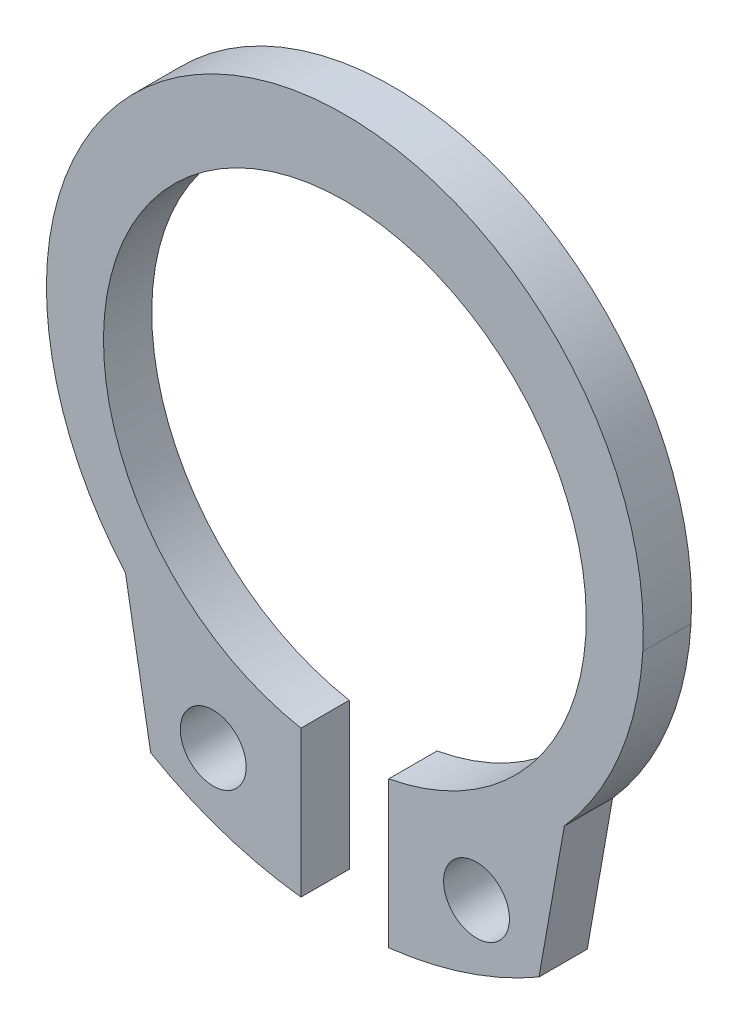
ISO-10303-21;
HEADER;
FILE_DESCRIPTION(('STEP AP214'),'2;1');
FILE_NAME('part.step','',(''),(''),'','','');
FILE_SCHEMA(('AUTOMOTIVE_DESIGN { 1 0 10303 214 1 1 1 1 }'));
ENDSEC;
DATA;
#1=APPLICATION_CONTEXT('core data for automotive mechanical design processes');
#2=APPLICATION_PROTOCOL_DEFINITION('international standard','automotive_design',2000,#1);
#3=PRODUCT_CONTEXT('',#1,'mechanical');
#4=PRODUCT('Part','Part','',(#3));
#5=PRODUCT_RELATED_PRODUCT_CATEGORY('part','',(#4));
#6=PRODUCT_DEFINITION_FORMATION('','',#4);
#7=PRODUCT_DEFINITION_CONTEXT('part definition',#1,'design');
#8=PRODUCT_DEFINITION('design','',#6,#7);
#9=PRODUCT_DEFINITION_SHAPE('','',#8);
#10=(LENGTH_UNIT() NAMED_UNIT(*) SI_UNIT(.MILLI.,.METRE.));
#11=(NAMED_UNIT(*) PLANE_ANGLE_UNIT() SI_UNIT($,.RADIAN.));
#12=(NAMED_UNIT(*) SI_UNIT($,.STERADIAN.) SOLID_ANGLE_UNIT());
#13=UNCERTAINTY_MEASURE_WITH_UNIT(LENGTH_MEASURE(1.E-05),#10,'distance_accuracy_value','');
#14=(GEOMETRIC_REPRESENTATION_CONTEXT(3) GLOBAL_UNCERTAINTY_ASSIGNED_CONTEXT((#13)) GLOBAL_UNIT_ASSIGNED_CONTEXT((#10,
#11,#12)) REPRESENTATION_CONTEXT('',''));
#15=CARTESIAN_POINT('',(0.,0.,0.));
#16=DIRECTION('',(0.,0.,1.));
#17=DIRECTION('',(1.,0.,0.));
#18=AXIS2_PLACEMENT_3D('',#15,#16,#17);
#19=CARTESIAN_POINT('',(0.399307358787697,0.423529411764706,1.1));
#20=DIRECTION('',(0.,0.,1.));
#21=DIRECTION('',(1.,0.,0.));
#22=AXIS2_PLACEMENT_3D('',#19,#20,#21);
#23=PLANE('',#22);
#24=CARTESIAN_POINT('',(3.,-6.8014928711435,1.1));
#25=DIRECTION('',(0.,0.,1.));
#26=DIRECTION('',(1.,0.,0.));
#27=AXIS2_PLACEMENT_3D('',#24,#25,#26);
#28=CIRCLE('',#27,0.75);
#29=CARTESIAN_POINT('',(3.75,-6.8014928711435,1.1));
#30=VERTEX_POINT('',#29);
#31=EDGE_CURVE('E267',#30,#30,#28,.T.);
#32=ORIENTED_EDGE('',*,*,#31,.F.);
#33=EDGE_LOOP('',(#32));
#34=FACE_BOUND('',#33,.T.);
#35=CARTESIAN_POINT('',(-3.,-6.8014928711435,1.1));
#36=DIRECTION('',(0.,0.,1.));
#37=DIRECTION('',(1.,0.,0.));
#38=AXIS2_PLACEMENT_3D('',#35,#36,#37);
#39=CIRCLE('',#38,0.75);
#40=CARTESIAN_POINT('',(-2.25,-6.8014928711435,1.1));
#41=VERTEX_POINT('',#40);
#42=EDGE_CURVE('E263',#41,#41,#39,.T.);
#43=ORIENTED_EDGE('',*,*,#42,.F.);
#44=EDGE_LOOP('',(#43));
#45=FACE_BOUND('',#44,.T.);
#46=CARTESIAN_POINT('',(0.,0.,1.1));
#47=DIRECTION('',(0.,0.,1.));
#48=DIRECTION('',(1.,0.,0.));
#49=AXIS2_PLACEMENT_3D('',#46,#47,#48);
#50=CIRCLE('',#49,8.8);
#51=CARTESIAN_POINT('',(-4.42383297256686,-7.607213802098,1.1));
#52=VERTEX_POINT('',#51);
#53=CARTESIAN_POINT('',(-1.,-8.74299719775776,1.1));
#54=VERTEX_POINT('',#53);
#55=EDGE_CURVE('E213',#52,#54,#50,.T.);
#56=ORIENTED_EDGE('',*,*,#55,.T.);
#57=DIRECTION('',(0.,1.,0.));
#58=VECTOR('',#57,1.);
#59=CARTESIAN_POINT('',(-1.,0.423529411764706,1.1));
#60=LINE('',#59,#58);
#61=CARTESIAN_POINT('',(-1.,-5.40832691319598,1.1));
#62=VERTEX_POINT('',#61);
#63=EDGE_CURVE('E125',#54,#62,#60,.T.);
#64=ORIENTED_EDGE('',*,*,#63,.T.);
#65=CARTESIAN_POINT('',(0.,0.,1.1));
#66=DIRECTION('',(0.,0.,1.));
#67=DIRECTION('',(1.,0.,0.));
#68=AXIS2_PLACEMENT_3D('',#65,#66,#67);
#69=CIRCLE('',#68,5.5);
#70=CARTESIAN_POINT('',(1.,-5.40832691319598,1.1));
#71=VERTEX_POINT('',#70);
#72=EDGE_CURVE('E200',#71,#62,#69,.T.);
#73=ORIENTED_EDGE('',*,*,#72,.F.);
#74=DIRECTION('',(0.,1.,0.));
#75=VECTOR('',#74,1.);
#76=CARTESIAN_POINT('',(1.,0.423529411764706,1.1));
#77=LINE('',#76,#75);
#78=CARTESIAN_POINT('',(1.,-8.74299719775776,1.1));
#79=VERTEX_POINT('',#78);
#80=EDGE_CURVE('E70',#79,#71,#77,.T.);
#81=ORIENTED_EDGE('',*,*,#80,.F.);
#82=CARTESIAN_POINT('',(4.42383297256686,-7.607213802098,1.1));
#83=VERTEX_POINT('',#82);
#84=EDGE_CURVE('E212',#79,#83,#50,.T.);
#85=ORIENTED_EDGE('',*,*,#84,.T.);
#86=DIRECTION('',(0.173648177666931,0.984807753012208,0.));
#87=VECTOR('',#86,1.);
#88=CARTESIAN_POINT('',(5.,-4.33960821435329,1.1));
#89=LINE('',#88,#87);
#90=CARTESIAN_POINT('',(5.,-4.33960821435329,1.1));
#91=VERTEX_POINT('',#90);
#92=EDGE_CURVE('E216',#83,#91,#89,.T.);
#93=ORIENTED_EDGE('',*,*,#92,.T.);
#94=CARTESIAN_POINT('',(-0.399307358787697,0.423529411764706,1.1));
#95=DIRECTION('',(0.,0.,1.));
#96=DIRECTION('',(-1.,0.,0.));
#97=AXIS2_PLACEMENT_3D('',#94,#95,#96);
#98=CIRCLE('',#97,7.2);
#99=CARTESIAN_POINT('',(6.78822509939086,0.,1.1));
#100=VERTEX_POINT('',#99);
#101=EDGE_CURVE('E219',#91,#100,#98,.T.);
#102=ORIENTED_EDGE('',*,*,#101,.T.);
#103=CARTESIAN_POINT('',(0.,0.4,1.1));
#104=DIRECTION('',(0.,0.,1.));
#105=DIRECTION('',(1.,0.,0.));
#106=AXIS2_PLACEMENT_3D('',#103,#104,#105);
#107=CIRCLE('',#106,6.8);
#108=CARTESIAN_POINT('',(-6.78822509939086,0.,1.1));
#109=VERTEX_POINT('',#108);
#110=EDGE_CURVE('E171',#100,#109,#107,.T.);
#111=ORIENTED_EDGE('',*,*,#110,.T.);
#112=CARTESIAN_POINT('',(0.399307358787697,0.423529411764706,1.1));
#113=DIRECTION('',(0.,0.,1.));
#114=DIRECTION('',(1.,0.,0.));
#115=AXIS2_PLACEMENT_3D('',#112,#113,#114);
#116=CIRCLE('',#115,7.2);
#117=CARTESIAN_POINT('',(-5.,-4.33960821435329,1.1));
#118=VERTEX_POINT('',#117);
#119=EDGE_CURVE('E165',#109,#118,#116,.T.);
#120=ORIENTED_EDGE('',*,*,#119,.T.);
#121=DIRECTION('',(0.173648177666931,-0.984807753012208,0.));
#122=VECTOR('',#121,1.);
#123=CARTESIAN_POINT('',(-5.,-4.33960821435329,1.1));
#124=LINE('',#123,#122);
#125=EDGE_CURVE('E209',#118,#52,#124,.T.);
#126=ORIENTED_EDGE('',*,*,#125,.T.);
#127=EDGE_LOOP('',(#56,#64,#73,#81,#85,#93,#102,#111,#120,#126));
#128=FACE_BOUND('',#127,.T.);
#129=ADVANCED_FACE('F47',(#34,#45,#128),#23,.T.);
#130=CARTESIAN_POINT('',(0.399307358787697,0.423529411764706,0.));
#131=DIRECTION('',(0.,0.,1.));
#132=DIRECTION('',(1.,0.,0.));
#133=AXIS2_PLACEMENT_3D('',#130,#131,#132);
#134=PLANE('',#133);
#135=CARTESIAN_POINT('',(3.,-6.8014928711435,0.));
#136=DIRECTION('',(0.,0.,1.));
#137=DIRECTION('',(1.,0.,0.));
#138=AXIS2_PLACEMENT_3D('',#135,#136,#137);
#139=CIRCLE('',#138,0.75);
#140=CARTESIAN_POINT('',(3.75,-6.8014928711435,0.));
#141=VERTEX_POINT('',#140);
#142=EDGE_CURVE('E142',#141,#141,#139,.T.);
#143=ORIENTED_EDGE('',*,*,#142,.T.);
#144=EDGE_LOOP('',(#143));
#145=FACE_BOUND('',#144,.T.);
#146=CARTESIAN_POINT('',(-3.,-6.8014928711435,0.));
#147=DIRECTION('',(0.,0.,1.));
#148=DIRECTION('',(1.,0.,0.));
#149=AXIS2_PLACEMENT_3D('',#146,#147,#148);
#150=CIRCLE('',#149,0.75);
#151=CARTESIAN_POINT('',(-2.25,-6.8014928711435,0.));
#152=VERTEX_POINT('',#151);
#153=EDGE_CURVE('E259',#152,#152,#150,.T.);
#154=ORIENTED_EDGE('',*,*,#153,.T.);
#155=EDGE_LOOP('',(#154));
#156=FACE_BOUND('',#155,.T.);
#157=DIRECTION('',(0.,1.,0.));
#158=VECTOR('',#157,1.);
#159=CARTESIAN_POINT('',(-1.,-4.62468328958563,0.));
#160=LINE('',#159,#158);
#161=CARTESIAN_POINT('',(-1.,-5.40832691319598,0.));
#162=VERTEX_POINT('',#161);
#163=CARTESIAN_POINT('',(-1.,-8.74299719775776,0.));
#164=VERTEX_POINT('',#163);
#165=EDGE_CURVE('E63',#162,#164,#160,.F.);
#166=ORIENTED_EDGE('',*,*,#165,.T.);
#167=CARTESIAN_POINT('',(0.,0.,0.));
#168=DIRECTION('',(0.,0.,1.));
#169=DIRECTION('',(1.,0.,0.));
#170=AXIS2_PLACEMENT_3D('',#167,#168,#169);
#171=CIRCLE('',#170,8.8);
#172=CARTESIAN_POINT('',(-4.42383297256686,-7.607213802098,0.));
#173=VERTEX_POINT('',#172);
#174=EDGE_CURVE('E137',#173,#164,#171,.T.);
#175=ORIENTED_EDGE('',*,*,#174,.F.);
#176=DIRECTION('',(0.173648177666931,-0.984807753012208,0.));
#177=VECTOR('',#176,1.);
#178=CARTESIAN_POINT('',(-5.,-4.33960821435329,0.));
#179=LINE('',#178,#177);
#180=CARTESIAN_POINT('',(-5.,-4.33960821435329,0.));
#181=VERTEX_POINT('',#180);
#182=EDGE_CURVE('E156',#181,#173,#179,.T.);
#183=ORIENTED_EDGE('',*,*,#182,.F.);
#184=CARTESIAN_POINT('',(0.399307358787697,0.423529411764706,0.));
#185=DIRECTION('',(0.,0.,1.));
#186=DIRECTION('',(1.,0.,0.));
#187=AXIS2_PLACEMENT_3D('',#184,#185,#186);
#188=CIRCLE('',#187,7.2);
#189=CARTESIAN_POINT('',(-6.78822509939086,0.,0.));
#190=VERTEX_POINT('',#189);
#191=EDGE_CURVE('E203',#190,#181,#188,.T.);
#192=ORIENTED_EDGE('',*,*,#191,.F.);
#193=CARTESIAN_POINT('',(0.,0.4,0.));
#194=DIRECTION('',(0.,0.,1.));
#195=DIRECTION('',(1.,0.,0.));
#196=AXIS2_PLACEMENT_3D('',#193,#194,#195);
#197=CIRCLE('',#196,6.8);
#198=CARTESIAN_POINT('',(6.78822509939086,0.,0.));
#199=VERTEX_POINT('',#198);
#200=EDGE_CURVE('E162',#199,#190,#197,.T.);
#201=ORIENTED_EDGE('',*,*,#200,.F.);
#202=CARTESIAN_POINT('',(-0.399307358787697,0.423529411764706,0.));
#203=DIRECTION('',(0.,0.,1.));
#204=DIRECTION('',(-1.,0.,0.));
#205=AXIS2_PLACEMENT_3D('',#202,#203,#204);
#206=CIRCLE('',#205,7.2);
#207=CARTESIAN_POINT('',(5.,-4.33960821435329,0.));
#208=VERTEX_POINT('',#207);
#209=EDGE_CURVE('E154',#208,#199,#206,.T.);
#210=ORIENTED_EDGE('',*,*,#209,.F.);
#211=DIRECTION('',(0.173648177666931,0.984807753012208,0.));
#212=VECTOR('',#211,1.);
#213=CARTESIAN_POINT('',(5.,-4.33960821435329,0.));
#214=LINE('',#213,#212);
#215=CARTESIAN_POINT('',(4.42383297256686,-7.607213802098,0.));
#216=VERTEX_POINT('',#215);
#217=EDGE_CURVE('E149',#216,#208,#214,.T.);
#218=ORIENTED_EDGE('',*,*,#217,.F.);
#219=CARTESIAN_POINT('',(1.,-8.74299719775776,0.));
#220=VERTEX_POINT('',#219);
#221=EDGE_CURVE('E150',#220,#216,#171,.T.);
#222=ORIENTED_EDGE('',*,*,#221,.F.);
#223=DIRECTION('',(0.,1.,0.));
#224=VECTOR('',#223,1.);
#225=CARTESIAN_POINT('',(1.,-4.62468328958563,0.));
#226=LINE('',#225,#224);
#227=CARTESIAN_POINT('',(1.,-5.40832691319598,0.));
#228=VERTEX_POINT('',#227);
#229=EDGE_CURVE('E141',#228,#220,#226,.F.);
#230=ORIENTED_EDGE('',*,*,#229,.F.);
#231=CARTESIAN_POINT('',(0.,0.,0.));
#232=DIRECTION('',(0.,0.,1.));
#233=DIRECTION('',(1.,0.,0.));
#234=AXIS2_PLACEMENT_3D('',#231,#232,#233);
#235=CIRCLE('',#234,5.5);
#236=EDGE_CURVE('E131',#228,#162,#235,.T.);
#237=ORIENTED_EDGE('',*,*,#236,.T.);
#238=EDGE_LOOP('',(#166,#175,#183,#192,#201,#210,#218,#222,#230,#237));
#239=FACE_BOUND('',#238,.T.);
#240=ADVANCED_FACE('F136',(#145,#156,#239),#134,.F.);
#241=CARTESIAN_POINT('',(0.,0.,1.1));
#242=DIRECTION('',(0.,0.,-1.));
#243=DIRECTION('',(-1.,0.,0.));
#244=AXIS2_PLACEMENT_3D('',#241,#242,#243);
#245=CYLINDRICAL_SURFACE('',#244,8.8);
#246=DIRECTION('',(0.,0.,-1.));
#247=VECTOR('',#246,1.);
#248=CARTESIAN_POINT('',(-1.,-8.74299719775776,1.1));
#249=LINE('',#248,#247);
#250=EDGE_CURVE('E122',#54,#164,#249,.T.);
#251=ORIENTED_EDGE('',*,*,#250,.F.);
#252=ORIENTED_EDGE('',*,*,#55,.F.);
#253=DIRECTION('',(0.,0.,-1.));
#254=VECTOR('',#253,1.);
#255=CARTESIAN_POINT('',(-4.42383297256686,-7.607213802098,1.1));
#256=LINE('',#255,#254);
#257=EDGE_CURVE('E147',#52,#173,#256,.T.);
#258=ORIENTED_EDGE('',*,*,#257,.T.);
#259=ORIENTED_EDGE('',*,*,#174,.T.);
#260=EDGE_LOOP('',(#251,#252,#258,#259));
#261=FACE_BOUND('',#260,.T.);
#262=ADVANCED_FACE('F145',(#261),#245,.T.);
#263=CARTESIAN_POINT('',(0.,0.,1.1));
#264=DIRECTION('',(0.,0.,-1.));
#265=DIRECTION('',(-1.,0.,0.));
#266=AXIS2_PLACEMENT_3D('',#263,#264,#265);
#267=CYLINDRICAL_SURFACE('',#266,5.5);
#268=ORIENTED_EDGE('',*,*,#72,.T.);
#269=DIRECTION('',(0.,0.,-1.));
#270=VECTOR('',#269,1.);
#271=CARTESIAN_POINT('',(-1.,-5.40832691319598,1.1));
#272=LINE('',#271,#270);
#273=EDGE_CURVE('E11',#62,#162,#272,.T.);
#274=ORIENTED_EDGE('',*,*,#273,.T.);
#275=ORIENTED_EDGE('',*,*,#236,.F.);
#276=DIRECTION('',(0.,0.,-1.));
#277=VECTOR('',#276,1.);
#278=CARTESIAN_POINT('',(1.,-5.40832691319598,1.1));
#279=LINE('',#278,#277);
#280=EDGE_CURVE('E56',#71,#228,#279,.T.);
#281=ORIENTED_EDGE('',*,*,#280,.F.);
#282=EDGE_LOOP('',(#268,#274,#275,#281));
#283=FACE_BOUND('',#282,.T.);
#284=ADVANCED_FACE('F198',(#283),#267,.F.);
#285=CARTESIAN_POINT('',(0.399307358787697,0.423529411764706,1.1));
#286=DIRECTION('',(0.,0.,-1.));
#287=DIRECTION('',(-1.,0.,0.));
#288=AXIS2_PLACEMENT_3D('',#285,#286,#287);
#289=CYLINDRICAL_SURFACE('',#288,7.2);
#290=ORIENTED_EDGE('',*,*,#191,.T.);
#291=DIRECTION('',(0.,0.,-1.));
#292=VECTOR('',#291,1.);
#293=CARTESIAN_POINT('',(-5.,-4.33960821435329,1.1));
#294=LINE('',#293,#292);
#295=EDGE_CURVE('E185',#118,#181,#294,.T.);
#296=ORIENTED_EDGE('',*,*,#295,.F.);
#297=ORIENTED_EDGE('',*,*,#119,.F.);
#298=DIRECTION('',(0.,0.,-1.));
#299=VECTOR('',#298,1.);
#300=CARTESIAN_POINT('',(-6.78822509939086,0.,1.1));
#301=LINE('',#300,#299);
#302=EDGE_CURVE('E166',#109,#190,#301,.T.);
#303=ORIENTED_EDGE('',*,*,#302,.T.);
#304=EDGE_LOOP('',(#290,#296,#297,#303));
#305=FACE_BOUND('',#304,.T.);
#306=ADVANCED_FACE('F49',(#305),#289,.T.);
#307=CARTESIAN_POINT('',(-5.,-4.33960821435329,1.1));
#308=DIRECTION('',(0.984807753012208,0.173648177666931,0.));
#309=DIRECTION('',(-0.173648177666931,0.984807753012208,0.));
#310=AXIS2_PLACEMENT_3D('',#307,#308,#309);
#311=PLANE('',#310);
#312=ORIENTED_EDGE('',*,*,#182,.T.);
#313=ORIENTED_EDGE('',*,*,#257,.F.);
#314=ORIENTED_EDGE('',*,*,#125,.F.);
#315=ORIENTED_EDGE('',*,*,#295,.T.);
#316=EDGE_LOOP('',(#312,#313,#314,#315));
#317=FACE_BOUND('',#316,.T.);
#318=ADVANCED_FACE('F230',(#317),#311,.F.);
#319=ORIENTED_EDGE('',*,*,#84,.F.);
#320=DIRECTION('',(0.,0.,-1.));
#321=VECTOR('',#320,1.);
#322=CARTESIAN_POINT('',(1.,-8.74299719775776,1.1));
#323=LINE('',#322,#321);
#324=EDGE_CURVE('E251',#79,#220,#323,.T.);
#325=ORIENTED_EDGE('',*,*,#324,.T.);
#326=ORIENTED_EDGE('',*,*,#221,.T.);
#327=DIRECTION('',(0.,0.,-1.));
#328=VECTOR('',#327,1.);
#329=CARTESIAN_POINT('',(4.42383297256686,-7.607213802098,1.1));
#330=LINE('',#329,#328);
#331=EDGE_CURVE('E179',#83,#216,#330,.T.);
#332=ORIENTED_EDGE('',*,*,#331,.F.);
#333=EDGE_LOOP('',(#319,#325,#326,#332));
#334=FACE_BOUND('',#333,.T.);
#335=ADVANCED_FACE('F250',(#334),#245,.T.);
#336=CARTESIAN_POINT('',(5.,-4.33960821435329,1.1));
#337=DIRECTION('',(-0.984807753012208,0.173648177666931,0.));
#338=DIRECTION('',(-0.173648177666931,-0.984807753012208,0.));
#339=AXIS2_PLACEMENT_3D('',#336,#337,#338);
#340=PLANE('',#339);
#341=ORIENTED_EDGE('',*,*,#217,.T.);
#342=DIRECTION('',(0.,0.,-1.));
#343=VECTOR('',#342,1.);
#344=CARTESIAN_POINT('',(5.,-4.33960821435329,1.1));
#345=LINE('',#344,#343);
#346=EDGE_CURVE('E175',#91,#208,#345,.T.);
#347=ORIENTED_EDGE('',*,*,#346,.F.);
#348=ORIENTED_EDGE('',*,*,#92,.F.);
#349=ORIENTED_EDGE('',*,*,#331,.T.);
#350=EDGE_LOOP('',(#341,#347,#348,#349));
#351=FACE_BOUND('',#350,.T.);
#352=ADVANCED_FACE('F246',(#351),#340,.F.);
#353=CARTESIAN_POINT('',(-0.399307358787697,0.423529411764706,1.1));
#354=DIRECTION('',(0.,0.,-1.));
#355=DIRECTION('',(-1.,0.,0.));
#356=AXIS2_PLACEMENT_3D('',#353,#354,#355);
#357=CYLINDRICAL_SURFACE('',#356,7.2);
#358=ORIENTED_EDGE('',*,*,#209,.T.);
#359=DIRECTION('',(0.,0.,-1.));
#360=VECTOR('',#359,1.);
#361=CARTESIAN_POINT('',(6.78822509939086,0.,1.1));
#362=LINE('',#361,#360);
#363=EDGE_CURVE('E170',#100,#199,#362,.T.);
#364=ORIENTED_EDGE('',*,*,#363,.F.);
#365=ORIENTED_EDGE('',*,*,#101,.F.);
#366=ORIENTED_EDGE('',*,*,#346,.T.);
#367=EDGE_LOOP('',(#358,#364,#365,#366));
#368=FACE_BOUND('',#367,.T.);
#369=ADVANCED_FACE('F244',(#368),#357,.T.);
#370=CARTESIAN_POINT('',(0.,0.4,1.1));
#371=DIRECTION('',(0.,0.,-1.));
#372=DIRECTION('',(-1.,0.,0.));
#373=AXIS2_PLACEMENT_3D('',#370,#371,#372);
#374=CYLINDRICAL_SURFACE('',#373,6.8);
#375=ORIENTED_EDGE('',*,*,#200,.T.);
#376=ORIENTED_EDGE('',*,*,#302,.F.);
#377=ORIENTED_EDGE('',*,*,#110,.F.);
#378=ORIENTED_EDGE('',*,*,#363,.T.);
#379=EDGE_LOOP('',(#375,#376,#377,#378));
#380=FACE_BOUND('',#379,.T.);
#381=ADVANCED_FACE('F235',(#380),#374,.T.);
#382=CARTESIAN_POINT('',(1.,-4.62468328958563,1.100012));
#383=DIRECTION('',(1.,0.,0.));
#384=DIRECTION('',(0.,0.,-1.));
#385=AXIS2_PLACEMENT_3D('',#382,#383,#384);
#386=PLANE('',#385);
#387=ORIENTED_EDGE('',*,*,#80,.T.);
#388=ORIENTED_EDGE('',*,*,#280,.T.);
#389=ORIENTED_EDGE('',*,*,#229,.T.);
#390=ORIENTED_EDGE('',*,*,#324,.F.);
#391=EDGE_LOOP('',(#387,#388,#389,#390));
#392=FACE_BOUND('',#391,.T.);
#393=ADVANCED_FACE('F189',(#392),#386,.F.);
#394=CARTESIAN_POINT('',(-1.,-4.62468328958563,1.100012));
#395=DIRECTION('',(1.,0.,0.));
#396=DIRECTION('',(0.,0.,-1.));
#397=AXIS2_PLACEMENT_3D('',#394,#395,#396);
#398=PLANE('',#397);
#399=ORIENTED_EDGE('',*,*,#250,.T.);
#400=ORIENTED_EDGE('',*,*,#165,.F.);
#401=ORIENTED_EDGE('',*,*,#273,.F.);
#402=ORIENTED_EDGE('',*,*,#63,.F.);
#403=EDGE_LOOP('',(#399,#400,#401,#402));
#404=FACE_BOUND('',#403,.T.);
#405=ADVANCED_FACE('F123',(#404),#398,.T.);
#406=CARTESIAN_POINT('',(-3.,-6.8014928711435,0.));
#407=DIRECTION('',(0.,0.,1.));
#408=DIRECTION('',(1.,0.,0.));
#409=AXIS2_PLACEMENT_3D('',#406,#407,#408);
#410=CYLINDRICAL_SURFACE('',#409,0.75);
#411=ORIENTED_EDGE('',*,*,#153,.F.);
#412=EDGE_LOOP('',(#411));
#413=FACE_BOUND('',#412,.T.);
#414=ORIENTED_EDGE('',*,*,#42,.T.);
#415=EDGE_LOOP('',(#414));
#416=FACE_BOUND('',#415,.T.);
#417=ADVANCED_FACE('F280',(#413,#416),#410,.F.);
#418=CARTESIAN_POINT('',(3.,-6.8014928711435,0.));
#419=DIRECTION('',(0.,0.,1.));
#420=DIRECTION('',(1.,0.,0.));
#421=AXIS2_PLACEMENT_3D('',#418,#419,#420);
#422=CYLINDRICAL_SURFACE('',#421,0.75);
#423=ORIENTED_EDGE('',*,*,#142,.F.);
#424=EDGE_LOOP('',(#423));
#425=FACE_BOUND('',#424,.T.);
#426=ORIENTED_EDGE('',*,*,#31,.T.);
#427=EDGE_LOOP('',(#426));
#428=FACE_BOUND('',#427,.T.);
#429=ADVANCED_FACE('F277',(#425,#428),#422,.F.);
#430=CLOSED_SHELL('',(#129,#240,#262,#284,#306,#318,#335,#352,#369,#381,#393,#405,#417,#429));
#431=MANIFOLD_SOLID_BREP('B2',#430);
#432=ADVANCED_BREP_SHAPE_REPRESENTATION('',(#18,#431),#14);
#433=SHAPE_DEFINITION_REPRESENTATION(#9,#432);
ENDSEC;
END-ISO-10303-21;
